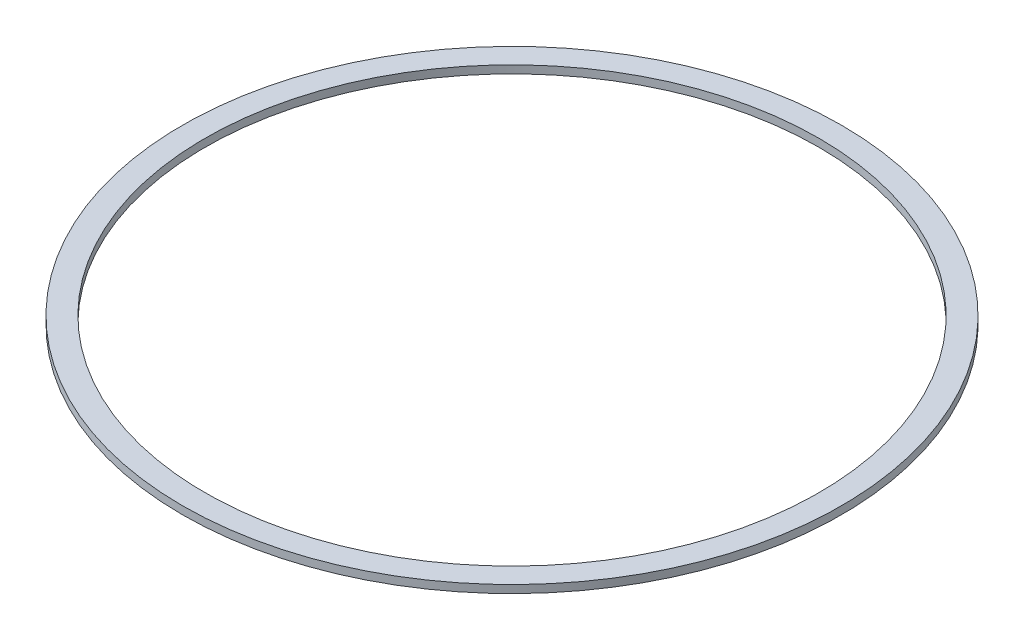
ISO-10303-21;
HEADER;
FILE_DESCRIPTION(('STEP AP214'),'2;1');
FILE_NAME('part.step','',(''),(''),'','','');
FILE_SCHEMA(('AUTOMOTIVE_DESIGN { 1 0 10303 214 1 1 1 1 }'));
ENDSEC;
DATA;
#1=APPLICATION_CONTEXT('core data for automotive mechanical design processes');
#2=APPLICATION_PROTOCOL_DEFINITION('international standard','automotive_design',2000,#1);
#3=PRODUCT_CONTEXT('',#1,'mechanical');
#4=PRODUCT('Part','Part','',(#3));
#5=PRODUCT_RELATED_PRODUCT_CATEGORY('part','',(#4));
#6=PRODUCT_DEFINITION_FORMATION('','',#4);
#7=PRODUCT_DEFINITION_CONTEXT('part definition',#1,'design');
#8=PRODUCT_DEFINITION('design','',#6,#7);
#9=PRODUCT_DEFINITION_SHAPE('','',#8);
#10=(LENGTH_UNIT() NAMED_UNIT(*) SI_UNIT(.MILLI.,.METRE.));
#11=(NAMED_UNIT(*) PLANE_ANGLE_UNIT() SI_UNIT($,.RADIAN.));
#12=(NAMED_UNIT(*) SI_UNIT($,.STERADIAN.) SOLID_ANGLE_UNIT());
#13=UNCERTAINTY_MEASURE_WITH_UNIT(LENGTH_MEASURE(1.E-05),#10,'distance_accuracy_value','');
#14=(GEOMETRIC_REPRESENTATION_CONTEXT(3) GLOBAL_UNCERTAINTY_ASSIGNED_CONTEXT((#13)) GLOBAL_UNIT_ASSIGNED_CONTEXT((#10,
#11,#12)) REPRESENTATION_CONTEXT('',''));
#15=CARTESIAN_POINT('',(0.,0.,0.));
#16=DIRECTION('',(0.,0.,1.));
#17=DIRECTION('',(1.,0.,0.));
#18=AXIS2_PLACEMENT_3D('',#15,#16,#17);
#19=CARTESIAN_POINT('',(-102.,3.175,0.));
#20=DIRECTION('',(0.,1.,0.));
#21=DIRECTION('',(0.,0.,1.));
#22=AXIS2_PLACEMENT_3D('',#19,#20,#21);
#23=PLANE('',#22);
#24=CARTESIAN_POINT('',(0.,3.17499999999882,0.));
#25=DIRECTION('',(0.,-1.,0.));
#26=DIRECTION('',(0.,0.,-1.));
#27=AXIS2_PLACEMENT_3D('',#24,#25,#26);
#28=CIRCLE('',#27,102.);
#29=CARTESIAN_POINT('',(0.,3.17499999999882,-102.));
#30=VERTEX_POINT('',#29);
#31=EDGE_CURVE('E53',#30,#30,#28,.T.);
#32=ORIENTED_EDGE('',*,*,#31,.F.);
#33=EDGE_LOOP('',(#32));
#34=FACE_BOUND('',#33,.T.);
#35=CARTESIAN_POINT('',(0.,3.17499999999882,0.));
#36=DIRECTION('',(0.,-1.,0.));
#37=DIRECTION('',(0.,0.,-1.));
#38=AXIS2_PLACEMENT_3D('',#35,#36,#37);
#39=CIRCLE('',#38,109.5);
#40=CARTESIAN_POINT('',(0.,3.17499999999882,-109.5));
#41=VERTEX_POINT('',#40);
#42=EDGE_CURVE('E10',#41,#41,#39,.T.);
#43=ORIENTED_EDGE('',*,*,#42,.T.);
#44=EDGE_LOOP('',(#43));
#45=FACE_BOUND('',#44,.T.);
#46=ADVANCED_FACE('F39',(#34,#45),#23,.F.);
#47=CARTESIAN_POINT('',(0.,-200069.047495165,0.));
#48=DIRECTION('',(0.,-1.,0.));
#49=DIRECTION('',(0.,0.,-1.));
#50=AXIS2_PLACEMENT_3D('',#47,#48,#49);
#51=CYLINDRICAL_SURFACE('',#50,109.5);
#52=ORIENTED_EDGE('',*,*,#42,.F.);
#53=EDGE_LOOP('',(#52));
#54=FACE_BOUND('',#53,.T.);
#55=CARTESIAN_POINT('',(0.,5.78500000000304,0.));
#56=DIRECTION('',(0.,-1.,0.));
#57=DIRECTION('',(0.,0.,-1.));
#58=AXIS2_PLACEMENT_3D('',#55,#56,#57);
#59=CIRCLE('',#58,109.5);
#60=CARTESIAN_POINT('',(0.,5.78500000000304,-109.5));
#61=VERTEX_POINT('',#60);
#62=EDGE_CURVE('E45',#61,#61,#59,.T.);
#63=ORIENTED_EDGE('',*,*,#62,.T.);
#64=EDGE_LOOP('',(#63));
#65=FACE_BOUND('',#64,.T.);
#66=ADVANCED_FACE('F62',(#54,#65),#51,.T.);
#67=CARTESIAN_POINT('',(-109.5,5.785,0.));
#68=DIRECTION('',(0.,-1.,0.));
#69=DIRECTION('',(0.,0.,-1.));
#70=AXIS2_PLACEMENT_3D('',#67,#68,#69);
#71=PLANE('',#70);
#72=ORIENTED_EDGE('',*,*,#62,.F.);
#73=EDGE_LOOP('',(#72));
#74=FACE_BOUND('',#73,.T.);
#75=CARTESIAN_POINT('',(0.,5.78500000000304,0.));
#76=DIRECTION('',(0.,-1.,0.));
#77=DIRECTION('',(0.,0.,-1.));
#78=AXIS2_PLACEMENT_3D('',#75,#76,#77);
#79=CIRCLE('',#78,102.);
#80=CARTESIAN_POINT('',(0.,5.78500000000304,-102.));
#81=VERTEX_POINT('',#80);
#82=EDGE_CURVE('E49',#81,#81,#79,.T.);
#83=ORIENTED_EDGE('',*,*,#82,.T.);
#84=EDGE_LOOP('',(#83));
#85=FACE_BOUND('',#84,.T.);
#86=ADVANCED_FACE('F66',(#74,#85),#71,.F.);
#87=CARTESIAN_POINT('',(0.,-200069.047495165,0.));
#88=DIRECTION('',(0.,-1.,0.));
#89=DIRECTION('',(0.,0.,-1.));
#90=AXIS2_PLACEMENT_3D('',#87,#88,#89);
#91=CYLINDRICAL_SURFACE('',#90,102.);
#92=ORIENTED_EDGE('',*,*,#82,.F.);
#93=EDGE_LOOP('',(#92));
#94=FACE_BOUND('',#93,.T.);
#95=ORIENTED_EDGE('',*,*,#31,.T.);
#96=EDGE_LOOP('',(#95));
#97=FACE_BOUND('',#96,.T.);
#98=ADVANCED_FACE('F59',(#94,#97),#91,.F.);
#99=CLOSED_SHELL('',(#46,#66,#86,#98));
#100=MANIFOLD_SOLID_BREP('B2',#99);
#101=ADVANCED_BREP_SHAPE_REPRESENTATION('',(#18,#100),#14);
#102=SHAPE_DEFINITION_REPRESENTATION(#9,#101);
ENDSEC;
END-ISO-10303-21;
